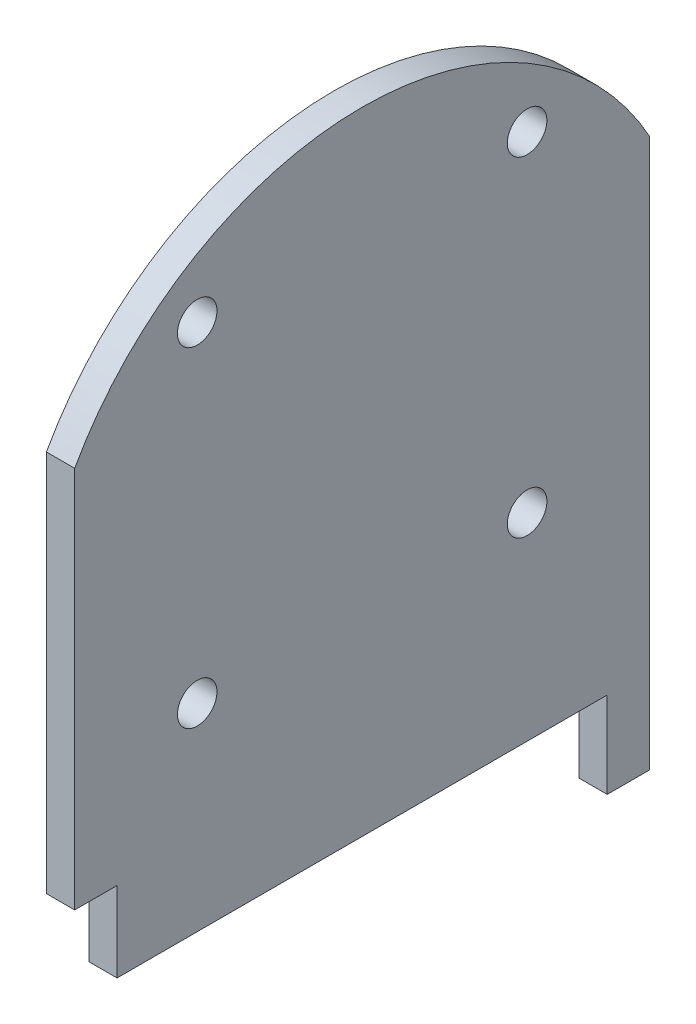
ISO-10303-21;
HEADER;
FILE_DESCRIPTION(('STEP AP214'),'2;1');
FILE_NAME('part.step','',(''),(''),'','','');
FILE_SCHEMA(('AUTOMOTIVE_DESIGN { 1 0 10303 214 1 1 1 1 }'));
ENDSEC;
DATA;
#1=APPLICATION_CONTEXT('core data for automotive mechanical design processes');
#2=APPLICATION_PROTOCOL_DEFINITION('international standard','automotive_design',2000,#1);
#3=PRODUCT_CONTEXT('',#1,'mechanical');
#4=PRODUCT('Part','Part','',(#3));
#5=PRODUCT_RELATED_PRODUCT_CATEGORY('part','',(#4));
#6=PRODUCT_DEFINITION_FORMATION('','',#4);
#7=PRODUCT_DEFINITION_CONTEXT('part definition',#1,'design');
#8=PRODUCT_DEFINITION('design','',#6,#7);
#9=PRODUCT_DEFINITION_SHAPE('','',#8);
#10=(LENGTH_UNIT() NAMED_UNIT(*) SI_UNIT(.MILLI.,.METRE.));
#11=(NAMED_UNIT(*) PLANE_ANGLE_UNIT() SI_UNIT($,.RADIAN.));
#12=(NAMED_UNIT(*) SI_UNIT($,.STERADIAN.) SOLID_ANGLE_UNIT());
#13=UNCERTAINTY_MEASURE_WITH_UNIT(LENGTH_MEASURE(1.E-05),#10,'distance_accuracy_value','');
#14=(GEOMETRIC_REPRESENTATION_CONTEXT(3) GLOBAL_UNCERTAINTY_ASSIGNED_CONTEXT((#13)) GLOBAL_UNIT_ASSIGNED_CONTEXT((#10,
#11,#12)) REPRESENTATION_CONTEXT('',''));
#15=CARTESIAN_POINT('',(0.,0.,0.));
#16=DIRECTION('',(0.,0.,1.));
#17=DIRECTION('',(1.,0.,0.));
#18=AXIS2_PLACEMENT_3D('',#15,#16,#17);
#19=CARTESIAN_POINT('',(-119.606649797075,-70.1818254764843,1056.6542593279));
#20=DIRECTION('',(1.,0.,0.));
#21=DIRECTION('',(0.,1.,0.));
#22=AXIS2_PLACEMENT_3D('',#19,#20,#21);
#23=PLANE('',#22);
#24=DIRECTION('',(0.,1.,0.));
#25=VECTOR('',#24,1.);
#26=CARTESIAN_POINT('',(-119.606649797075,-111.41605937263,1030.6542593279));
#27=LINE('',#26,#25);
#28=CARTESIAN_POINT('',(-119.606649797075,-111.41605937263,1030.6542593279));
#29=VERTEX_POINT('',#28);
#30=CARTESIAN_POINT('',(-119.606649797075,-102.283530385521,1030.6542593279));
#31=VERTEX_POINT('',#30);
#32=EDGE_CURVE('E154',#29,#31,#27,.T.);
#33=ORIENTED_EDGE('',*,*,#32,.T.);
#34=DIRECTION('',(0.,0.,1.));
#35=VECTOR('',#34,1.);
#36=CARTESIAN_POINT('',(-119.606649797075,-102.283530385521,1030.6542593279));
#37=LINE('',#36,#35);
#38=CARTESIAN_POINT('',(-119.606649797075,-102.283530385521,1082.6542593279));
#39=VERTEX_POINT('',#38);
#40=EDGE_CURVE('E100',#31,#39,#37,.T.);
#41=ORIENTED_EDGE('',*,*,#40,.T.);
#42=DIRECTION('',(0.,1.,0.));
#43=VECTOR('',#42,1.);
#44=CARTESIAN_POINT('',(-119.606649797075,-102.283530385521,1082.6542593279));
#45=LINE('',#44,#43);
#46=CARTESIAN_POINT('',(-119.606649797075,-93.7835303855215,1082.6542593279));
#47=VERTEX_POINT('',#46);
#48=EDGE_CURVE('E169',#39,#47,#45,.T.);
#49=ORIENTED_EDGE('',*,*,#48,.T.);
#50=DIRECTION('',(0.,0.,1.));
#51=VECTOR('',#50,1.);
#52=CARTESIAN_POINT('',(-119.606649797075,-93.7835303855215,1082.6542593279));
#53=LINE('',#52,#51);
#54=CARTESIAN_POINT('',(-119.606649797075,-93.7835303855215,1087.1542593279));
#55=VERTEX_POINT('',#54);
#56=EDGE_CURVE('E181',#47,#55,#53,.T.);
#57=ORIENTED_EDGE('',*,*,#56,.T.);
#58=DIRECTION('',(0.,1.,0.));
#59=VECTOR('',#58,1.);
#60=CARTESIAN_POINT('',(-119.606649797075,-93.7835303855215,1087.1542593279));
#61=LINE('',#60,#59);
#62=CARTESIAN_POINT('',(-119.606649797075,-53.2007110136831,1087.1542593279));
#63=VERTEX_POINT('',#62);
#64=EDGE_CURVE('E119',#55,#63,#61,.T.);
#65=ORIENTED_EDGE('',*,*,#64,.T.);
#66=CARTESIAN_POINT('',(-119.606649797075,-70.1818254764843,1056.6542593279));
#67=DIRECTION('',(-1.,0.,0.));
#68=DIRECTION('',(0.,1.,0.));
#69=AXIS2_PLACEMENT_3D('',#66,#67,#68);
#70=CIRCLE('',#69,34.9085698417846);
#71=CARTESIAN_POINT('',(-119.606649797075,-53.2007110136831,1026.1542593279));
#72=VERTEX_POINT('',#71);
#73=EDGE_CURVE('E113',#63,#72,#70,.T.);
#74=ORIENTED_EDGE('',*,*,#73,.T.);
#75=DIRECTION('',(0.,-1.,0.));
#76=VECTOR('',#75,1.);
#77=CARTESIAN_POINT('',(-119.606649797075,-53.2007110136831,1026.1542593279));
#78=LINE('',#77,#76);
#79=CARTESIAN_POINT('',(-119.606649797075,-111.41605937263,1026.1542593279));
#80=VERTEX_POINT('',#79);
#81=EDGE_CURVE('E117',#72,#80,#78,.T.);
#82=ORIENTED_EDGE('',*,*,#81,.T.);
#83=DIRECTION('',(0.,0.,1.));
#84=VECTOR('',#83,1.);
#85=CARTESIAN_POINT('',(-119.606649797075,-111.41605937263,1026.1542593279));
#86=LINE('',#85,#84);
#87=EDGE_CURVE('E58',#80,#29,#86,.T.);
#88=ORIENTED_EDGE('',*,*,#87,.T.);
#89=EDGE_LOOP('',(#33,#41,#49,#57,#65,#74,#82,#88));
#90=FACE_BOUND('',#89,.T.);
#91=CARTESIAN_POINT('',(-119.606649797075,-81.2835303855224,1074.1542593279));
#92=DIRECTION('',(-1.,0.,0.));
#93=DIRECTION('',(0.,-1.,0.));
#94=AXIS2_PLACEMENT_3D('',#91,#92,#93);
#95=CIRCLE('',#94,2.09999999999993);
#96=CARTESIAN_POINT('',(-119.606649797075,-83.3835303855224,1074.1542593279));
#97=VERTEX_POINT('',#96);
#98=EDGE_CURVE('E142',#97,#97,#95,.T.);
#99=ORIENTED_EDGE('',*,*,#98,.F.);
#100=EDGE_LOOP('',(#99));
#101=FACE_BOUND('',#100,.T.);
#102=CARTESIAN_POINT('',(-119.606649797075,-81.2835303855215,1039.1542593279));
#103=DIRECTION('',(-1.,0.,0.));
#104=DIRECTION('',(0.,-1.,0.));
#105=AXIS2_PLACEMENT_3D('',#102,#103,#104);
#106=CIRCLE('',#105,2.09999999999993);
#107=CARTESIAN_POINT('',(-119.606649797075,-83.3835303855214,1039.1542593279));
#108=VERTEX_POINT('',#107);
#109=EDGE_CURVE('E190',#108,#108,#106,.T.);
#110=ORIENTED_EDGE('',*,*,#109,.F.);
#111=EDGE_LOOP('',(#110));
#112=FACE_BOUND('',#111,.T.);
#113=CARTESIAN_POINT('',(-119.606649797075,-46.2835303855224,1074.1542593279));
#114=DIRECTION('',(-1.,0.,0.));
#115=DIRECTION('',(0.,-1.,0.));
#116=AXIS2_PLACEMENT_3D('',#113,#114,#115);
#117=CIRCLE('',#116,2.09999999999994);
#118=CARTESIAN_POINT('',(-119.606649797075,-48.3835303855224,1074.1542593279));
#119=VERTEX_POINT('',#118);
#120=EDGE_CURVE('E196',#119,#119,#117,.T.);
#121=ORIENTED_EDGE('',*,*,#120,.F.);
#122=EDGE_LOOP('',(#121));
#123=FACE_BOUND('',#122,.T.);
#124=CARTESIAN_POINT('',(-119.606649797075,-46.2835303855215,1039.1542593279));
#125=DIRECTION('',(-1.,0.,0.));
#126=DIRECTION('',(0.,-1.,0.));
#127=AXIS2_PLACEMENT_3D('',#124,#125,#126);
#128=CIRCLE('',#127,2.09999999999994);
#129=CARTESIAN_POINT('',(-119.606649797075,-48.3835303855214,1039.1542593279));
#130=VERTEX_POINT('',#129);
#131=EDGE_CURVE('E202',#130,#130,#128,.T.);
#132=ORIENTED_EDGE('',*,*,#131,.F.);
#133=EDGE_LOOP('',(#132));
#134=FACE_BOUND('',#133,.T.);
#135=ADVANCED_FACE('F41',(#90,#101,#112,#123,#134),#23,.F.);
#136=CARTESIAN_POINT('',(-116.606649797075,-70.1818254764843,1056.6542593279));
#137=DIRECTION('',(1.,0.,0.));
#138=DIRECTION('',(0.,1.,0.));
#139=AXIS2_PLACEMENT_3D('',#136,#137,#138);
#140=PLANE('',#139);
#141=CARTESIAN_POINT('',(-116.606649797075,-46.2835303855224,1074.1542593279));
#142=DIRECTION('',(-1.,0.,0.));
#143=DIRECTION('',(0.,-1.,0.));
#144=AXIS2_PLACEMENT_3D('',#141,#142,#143);
#145=CIRCLE('',#144,2.09999999999994);
#146=CARTESIAN_POINT('',(-116.606649797075,-48.3835303855224,1074.1542593279));
#147=VERTEX_POINT('',#146);
#148=EDGE_CURVE('E199',#147,#147,#145,.T.);
#149=ORIENTED_EDGE('',*,*,#148,.T.);
#150=EDGE_LOOP('',(#149));
#151=FACE_BOUND('',#150,.T.);
#152=CARTESIAN_POINT('',(-116.606649797075,-81.2835303855224,1074.1542593279));
#153=DIRECTION('',(-1.,0.,0.));
#154=DIRECTION('',(0.,-1.,0.));
#155=AXIS2_PLACEMENT_3D('',#152,#153,#154);
#156=CIRCLE('',#155,2.09999999999993);
#157=CARTESIAN_POINT('',(-116.606649797075,-83.3835303855224,1074.1542593279));
#158=VERTEX_POINT('',#157);
#159=EDGE_CURVE('E187',#158,#158,#156,.T.);
#160=ORIENTED_EDGE('',*,*,#159,.T.);
#161=EDGE_LOOP('',(#160));
#162=FACE_BOUND('',#161,.T.);
#163=DIRECTION('',(0.,1.,0.));
#164=VECTOR('',#163,1.);
#165=CARTESIAN_POINT('',(-116.606649797075,-111.41605937263,1030.6542593279));
#166=LINE('',#165,#164);
#167=CARTESIAN_POINT('',(-116.606649797075,-111.41605937263,1030.6542593279));
#168=VERTEX_POINT('',#167);
#169=CARTESIAN_POINT('',(-116.606649797075,-102.283530385521,1030.6542593279));
#170=VERTEX_POINT('',#169);
#171=EDGE_CURVE('E138',#168,#170,#166,.T.);
#172=ORIENTED_EDGE('',*,*,#171,.F.);
#173=DIRECTION('',(0.,0.,1.));
#174=VECTOR('',#173,1.);
#175=CARTESIAN_POINT('',(-116.606649797075,-111.41605937263,1026.1542593279));
#176=LINE('',#175,#174);
#177=CARTESIAN_POINT('',(-116.606649797075,-111.41605937263,1026.1542593279));
#178=VERTEX_POINT('',#177);
#179=EDGE_CURVE('E92',#178,#168,#176,.T.);
#180=ORIENTED_EDGE('',*,*,#179,.F.);
#181=DIRECTION('',(0.,-1.,0.));
#182=VECTOR('',#181,1.);
#183=CARTESIAN_POINT('',(-116.606649797075,-63.7835303855215,1026.1542593279));
#184=LINE('',#183,#182);
#185=CARTESIAN_POINT('',(-116.606649797075,-53.2007110136831,1026.1542593279));
#186=VERTEX_POINT('',#185);
#187=EDGE_CURVE('E86',#186,#178,#184,.T.);
#188=ORIENTED_EDGE('',*,*,#187,.F.);
#189=CARTESIAN_POINT('',(-116.606649797075,-70.1818254764843,1056.6542593279));
#190=DIRECTION('',(-1.,0.,0.));
#191=DIRECTION('',(0.,1.,0.));
#192=AXIS2_PLACEMENT_3D('',#189,#190,#191);
#193=CIRCLE('',#192,34.9085698417846);
#194=CARTESIAN_POINT('',(-116.606649797075,-53.2007110136831,1087.1542593279));
#195=VERTEX_POINT('',#194);
#196=EDGE_CURVE('E128',#195,#186,#193,.T.);
#197=ORIENTED_EDGE('',*,*,#196,.F.);
#198=DIRECTION('',(0.,1.,0.));
#199=VECTOR('',#198,1.);
#200=CARTESIAN_POINT('',(-116.606649797075,-63.7835303855215,1087.1542593279));
#201=LINE('',#200,#199);
#202=CARTESIAN_POINT('',(-116.606649797075,-93.7835303855215,1087.1542593279));
#203=VERTEX_POINT('',#202);
#204=EDGE_CURVE('E149',#203,#195,#201,.T.);
#205=ORIENTED_EDGE('',*,*,#204,.F.);
#206=DIRECTION('',(0.,0.,1.));
#207=VECTOR('',#206,1.);
#208=CARTESIAN_POINT('',(-116.606649797075,-93.7835303855215,1082.6542593279));
#209=LINE('',#208,#207);
#210=CARTESIAN_POINT('',(-116.606649797075,-93.7835303855215,1082.6542593279));
#211=VERTEX_POINT('',#210);
#212=EDGE_CURVE('E146',#211,#203,#209,.T.);
#213=ORIENTED_EDGE('',*,*,#212,.F.);
#214=DIRECTION('',(0.,1.,0.));
#215=VECTOR('',#214,1.);
#216=CARTESIAN_POINT('',(-116.606649797075,-102.283530385521,1082.6542593279));
#217=LINE('',#216,#215);
#218=CARTESIAN_POINT('',(-116.606649797075,-102.283530385521,1082.6542593279));
#219=VERTEX_POINT('',#218);
#220=EDGE_CURVE('E144',#219,#211,#217,.T.);
#221=ORIENTED_EDGE('',*,*,#220,.F.);
#222=DIRECTION('',(0.,0.,1.));
#223=VECTOR('',#222,1.);
#224=CARTESIAN_POINT('',(-116.606649797075,-102.283530385521,1030.6542593279));
#225=LINE('',#224,#223);
#226=EDGE_CURVE('E141',#170,#219,#225,.T.);
#227=ORIENTED_EDGE('',*,*,#226,.F.);
#228=EDGE_LOOP('',(#172,#180,#188,#197,#205,#213,#221,#227));
#229=FACE_BOUND('',#228,.T.);
#230=CARTESIAN_POINT('',(-116.606649797075,-81.2835303855215,1039.1542593279));
#231=DIRECTION('',(-1.,0.,0.));
#232=DIRECTION('',(0.,-1.,0.));
#233=AXIS2_PLACEMENT_3D('',#230,#231,#232);
#234=CIRCLE('',#233,2.09999999999993);
#235=CARTESIAN_POINT('',(-116.606649797075,-83.3835303855214,1039.1542593279));
#236=VERTEX_POINT('',#235);
#237=EDGE_CURVE('E193',#236,#236,#234,.T.);
#238=ORIENTED_EDGE('',*,*,#237,.T.);
#239=EDGE_LOOP('',(#238));
#240=FACE_BOUND('',#239,.T.);
#241=CARTESIAN_POINT('',(-116.606649797075,-46.2835303855215,1039.1542593279));
#242=DIRECTION('',(-1.,0.,0.));
#243=DIRECTION('',(0.,-1.,0.));
#244=AXIS2_PLACEMENT_3D('',#241,#242,#243);
#245=CIRCLE('',#244,2.09999999999994);
#246=CARTESIAN_POINT('',(-116.606649797075,-48.3835303855214,1039.1542593279));
#247=VERTEX_POINT('',#246);
#248=EDGE_CURVE('E205',#247,#247,#245,.T.);
#249=ORIENTED_EDGE('',*,*,#248,.T.);
#250=EDGE_LOOP('',(#249));
#251=FACE_BOUND('',#250,.T.);
#252=ADVANCED_FACE('F173',(#151,#162,#229,#240,#251),#140,.T.);
#253=CARTESIAN_POINT('',(-119.606649797075,-111.41605937263,1030.6542593279));
#254=DIRECTION('',(0.,0.,-1.));
#255=DIRECTION('',(-1.,0.,0.));
#256=AXIS2_PLACEMENT_3D('',#253,#254,#255);
#257=PLANE('',#256);
#258=ORIENTED_EDGE('',*,*,#171,.T.);
#259=DIRECTION('',(1.,0.,0.));
#260=VECTOR('',#259,1.);
#261=CARTESIAN_POINT('',(-119.606649797075,-102.283530385521,1030.6542593279));
#262=LINE('',#261,#260);
#263=EDGE_CURVE('E11',#31,#170,#262,.T.);
#264=ORIENTED_EDGE('',*,*,#263,.F.);
#265=ORIENTED_EDGE('',*,*,#32,.F.);
#266=DIRECTION('',(1.,0.,0.));
#267=VECTOR('',#266,1.);
#268=CARTESIAN_POINT('',(-119.606649797075,-111.41605937263,1030.6542593279));
#269=LINE('',#268,#267);
#270=EDGE_CURVE('E134',#29,#168,#269,.T.);
#271=ORIENTED_EDGE('',*,*,#270,.T.);
#272=EDGE_LOOP('',(#258,#264,#265,#271));
#273=FACE_BOUND('',#272,.T.);
#274=ADVANCED_FACE('F43',(#273),#257,.F.);
#275=CARTESIAN_POINT('',(-119.606649797075,-102.283530385521,1030.6542593279));
#276=DIRECTION('',(0.,1.,0.));
#277=DIRECTION('',(-1.,0.,0.));
#278=AXIS2_PLACEMENT_3D('',#275,#276,#277);
#279=PLANE('',#278);
#280=ORIENTED_EDGE('',*,*,#226,.T.);
#281=DIRECTION('',(1.,0.,0.));
#282=VECTOR('',#281,1.);
#283=CARTESIAN_POINT('',(-119.606649797075,-102.283530385521,1082.6542593279));
#284=LINE('',#283,#282);
#285=EDGE_CURVE('E50',#39,#219,#284,.T.);
#286=ORIENTED_EDGE('',*,*,#285,.F.);
#287=ORIENTED_EDGE('',*,*,#40,.F.);
#288=ORIENTED_EDGE('',*,*,#263,.T.);
#289=EDGE_LOOP('',(#280,#286,#287,#288));
#290=FACE_BOUND('',#289,.T.);
#291=ADVANCED_FACE('F237',(#290),#279,.F.);
#292=CARTESIAN_POINT('',(-119.606649797075,-102.283530385521,1082.6542593279));
#293=DIRECTION('',(0.,0.,-1.));
#294=DIRECTION('',(-1.,0.,0.));
#295=AXIS2_PLACEMENT_3D('',#292,#293,#294);
#296=PLANE('',#295);
#297=ORIENTED_EDGE('',*,*,#220,.T.);
#298=DIRECTION('',(1.,0.,0.));
#299=VECTOR('',#298,1.);
#300=CARTESIAN_POINT('',(-119.606649797075,-93.7835303855215,1082.6542593279));
#301=LINE('',#300,#299);
#302=EDGE_CURVE('E161',#47,#211,#301,.T.);
#303=ORIENTED_EDGE('',*,*,#302,.F.);
#304=ORIENTED_EDGE('',*,*,#48,.F.);
#305=ORIENTED_EDGE('',*,*,#285,.T.);
#306=EDGE_LOOP('',(#297,#303,#304,#305));
#307=FACE_BOUND('',#306,.T.);
#308=ADVANCED_FACE('F167',(#307),#296,.F.);
#309=CARTESIAN_POINT('',(-119.606649797075,-93.7835303855215,1082.6542593279));
#310=DIRECTION('',(0.,1.,0.));
#311=DIRECTION('',(-1.,0.,0.));
#312=AXIS2_PLACEMENT_3D('',#309,#310,#311);
#313=PLANE('',#312);
#314=ORIENTED_EDGE('',*,*,#212,.T.);
#315=DIRECTION('',(1.,0.,0.));
#316=VECTOR('',#315,1.);
#317=CARTESIAN_POINT('',(-119.606649797075,-93.7835303855215,1087.1542593279));
#318=LINE('',#317,#316);
#319=EDGE_CURVE('E158',#55,#203,#318,.T.);
#320=ORIENTED_EDGE('',*,*,#319,.F.);
#321=ORIENTED_EDGE('',*,*,#56,.F.);
#322=ORIENTED_EDGE('',*,*,#302,.T.);
#323=EDGE_LOOP('',(#314,#320,#321,#322));
#324=FACE_BOUND('',#323,.T.);
#325=ADVANCED_FACE('F177',(#324),#313,.F.);
#326=CARTESIAN_POINT('',(-119.606649797075,-63.7835303855215,1087.1542593279));
#327=DIRECTION('',(0.,0.,-1.));
#328=DIRECTION('',(-1.,0.,0.));
#329=AXIS2_PLACEMENT_3D('',#326,#327,#328);
#330=PLANE('',#329);
#331=ORIENTED_EDGE('',*,*,#204,.T.);
#332=DIRECTION('',(1.,0.,0.));
#333=VECTOR('',#332,1.);
#334=CARTESIAN_POINT('',(-119.606649797075,-53.2007110136831,1087.1542593279));
#335=LINE('',#334,#333);
#336=EDGE_CURVE('E129',#63,#195,#335,.T.);
#337=ORIENTED_EDGE('',*,*,#336,.F.);
#338=ORIENTED_EDGE('',*,*,#64,.F.);
#339=ORIENTED_EDGE('',*,*,#319,.T.);
#340=EDGE_LOOP('',(#331,#337,#338,#339));
#341=FACE_BOUND('',#340,.T.);
#342=ADVANCED_FACE('F180',(#341),#330,.F.);
#343=CARTESIAN_POINT('',(-119.606649797075,-70.1818254764843,1056.6542593279));
#344=DIRECTION('',(1.,0.,0.));
#345=DIRECTION('',(0.,1.,0.));
#346=AXIS2_PLACEMENT_3D('',#343,#344,#345);
#347=CYLINDRICAL_SURFACE('',#346,34.9085698417846);
#348=ORIENTED_EDGE('',*,*,#196,.T.);
#349=DIRECTION('',(1.,0.,0.));
#350=VECTOR('',#349,1.);
#351=CARTESIAN_POINT('',(-119.606649797075,-53.2007110136831,1026.1542593279));
#352=LINE('',#351,#350);
#353=EDGE_CURVE('E125',#72,#186,#352,.T.);
#354=ORIENTED_EDGE('',*,*,#353,.F.);
#355=ORIENTED_EDGE('',*,*,#73,.F.);
#356=ORIENTED_EDGE('',*,*,#336,.T.);
#357=EDGE_LOOP('',(#348,#354,#355,#356));
#358=FACE_BOUND('',#357,.T.);
#359=ADVANCED_FACE('F126',(#358),#347,.T.);
#360=CARTESIAN_POINT('',(-119.606649797075,-63.7835303855215,1026.1542593279));
#361=DIRECTION('',(0.,0.,1.));
#362=DIRECTION('',(1.,0.,0.));
#363=AXIS2_PLACEMENT_3D('',#360,#361,#362);
#364=PLANE('',#363);
#365=ORIENTED_EDGE('',*,*,#187,.T.);
#366=DIRECTION('',(1.,0.,0.));
#367=VECTOR('',#366,1.);
#368=CARTESIAN_POINT('',(-119.606649797075,-111.41605937263,1026.1542593279));
#369=LINE('',#368,#367);
#370=EDGE_CURVE('E130',#80,#178,#369,.T.);
#371=ORIENTED_EDGE('',*,*,#370,.F.);
#372=ORIENTED_EDGE('',*,*,#81,.F.);
#373=ORIENTED_EDGE('',*,*,#353,.T.);
#374=EDGE_LOOP('',(#365,#371,#372,#373));
#375=FACE_BOUND('',#374,.T.);
#376=ADVANCED_FACE('F132',(#375),#364,.F.);
#377=CARTESIAN_POINT('',(-119.606649797075,-111.41605937263,1026.1542593279));
#378=DIRECTION('',(0.,1.,0.));
#379=DIRECTION('',(-1.,0.,0.));
#380=AXIS2_PLACEMENT_3D('',#377,#378,#379);
#381=PLANE('',#380);
#382=ORIENTED_EDGE('',*,*,#179,.T.);
#383=ORIENTED_EDGE('',*,*,#270,.F.);
#384=ORIENTED_EDGE('',*,*,#87,.F.);
#385=ORIENTED_EDGE('',*,*,#370,.T.);
#386=EDGE_LOOP('',(#382,#383,#384,#385));
#387=FACE_BOUND('',#386,.T.);
#388=ADVANCED_FACE('F225',(#387),#381,.F.);
#389=CARTESIAN_POINT('',(-119.606649797075,-81.2835303855224,1074.1542593279));
#390=DIRECTION('',(1.,0.,0.));
#391=DIRECTION('',(0.,1.,0.));
#392=AXIS2_PLACEMENT_3D('',#389,#390,#391);
#393=CYLINDRICAL_SURFACE('',#392,2.09999999999993);
#394=ORIENTED_EDGE('',*,*,#98,.T.);
#395=EDGE_LOOP('',(#394));
#396=FACE_BOUND('',#395,.T.);
#397=ORIENTED_EDGE('',*,*,#159,.F.);
#398=EDGE_LOOP('',(#397));
#399=FACE_BOUND('',#398,.T.);
#400=ADVANCED_FACE('F222',(#396,#399),#393,.F.);
#401=CARTESIAN_POINT('',(-119.606649797075,-81.2835303855215,1039.1542593279));
#402=DIRECTION('',(1.,0.,0.));
#403=DIRECTION('',(0.,1.,0.));
#404=AXIS2_PLACEMENT_3D('',#401,#402,#403);
#405=CYLINDRICAL_SURFACE('',#404,2.09999999999993);
#406=ORIENTED_EDGE('',*,*,#109,.T.);
#407=EDGE_LOOP('',(#406));
#408=FACE_BOUND('',#407,.T.);
#409=ORIENTED_EDGE('',*,*,#237,.F.);
#410=EDGE_LOOP('',(#409));
#411=FACE_BOUND('',#410,.T.);
#412=ADVANCED_FACE('F302',(#408,#411),#405,.F.);
#413=CARTESIAN_POINT('',(-119.606649797075,-46.2835303855224,1074.1542593279));
#414=DIRECTION('',(1.,0.,0.));
#415=DIRECTION('',(0.,1.,0.));
#416=AXIS2_PLACEMENT_3D('',#413,#414,#415);
#417=CYLINDRICAL_SURFACE('',#416,2.09999999999994);
#418=ORIENTED_EDGE('',*,*,#120,.T.);
#419=EDGE_LOOP('',(#418));
#420=FACE_BOUND('',#419,.T.);
#421=ORIENTED_EDGE('',*,*,#148,.F.);
#422=EDGE_LOOP('',(#421));
#423=FACE_BOUND('',#422,.T.);
#424=ADVANCED_FACE('F310',(#420,#423),#417,.F.);
#425=CARTESIAN_POINT('',(-119.606649797075,-46.2835303855215,1039.1542593279));
#426=DIRECTION('',(1.,0.,0.));
#427=DIRECTION('',(0.,1.,0.));
#428=AXIS2_PLACEMENT_3D('',#425,#426,#427);
#429=CYLINDRICAL_SURFACE('',#428,2.09999999999994);
#430=ORIENTED_EDGE('',*,*,#131,.T.);
#431=EDGE_LOOP('',(#430));
#432=FACE_BOUND('',#431,.T.);
#433=ORIENTED_EDGE('',*,*,#248,.F.);
#434=EDGE_LOOP('',(#433));
#435=FACE_BOUND('',#434,.T.);
#436=ADVANCED_FACE('F211',(#432,#435),#429,.F.);
#437=CLOSED_SHELL('',(#135,#252,#274,#291,#308,#325,#342,#359,#376,#388,#400,#412,#424,#436));
#438=MANIFOLD_SOLID_BREP('B2',#437);
#439=ADVANCED_BREP_SHAPE_REPRESENTATION('',(#18,#438),#14);
#440=SHAPE_DEFINITION_REPRESENTATION(#9,#439);
ENDSEC;
END-ISO-10303-21;
